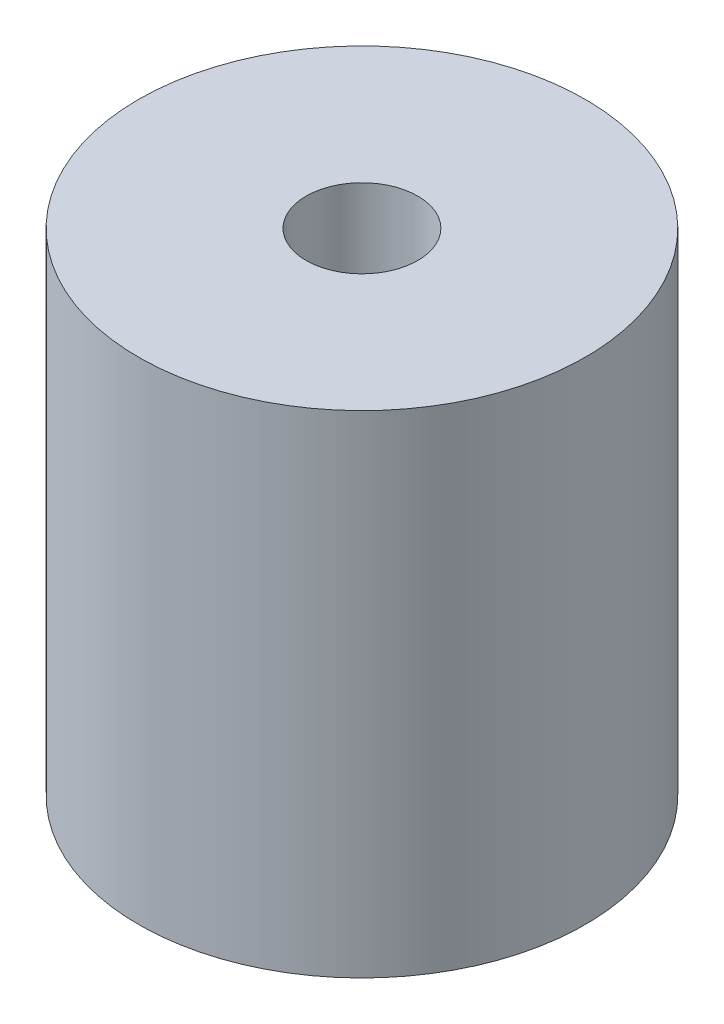
ISO-10303-21;
HEADER;
FILE_DESCRIPTION(('STEP AP214'),'2;1');
FILE_NAME('part.step','',(''),(''),'','','');
FILE_SCHEMA(('AUTOMOTIVE_DESIGN { 1 0 10303 214 1 1 1 1 }'));
ENDSEC;
DATA;
#1=APPLICATION_CONTEXT('core data for automotive mechanical design processes');
#2=APPLICATION_PROTOCOL_DEFINITION('international standard','automotive_design',2000,#1);
#3=PRODUCT_CONTEXT('',#1,'mechanical');
#4=PRODUCT('Part','Part','',(#3));
#5=PRODUCT_RELATED_PRODUCT_CATEGORY('part','',(#4));
#6=PRODUCT_DEFINITION_FORMATION('','',#4);
#7=PRODUCT_DEFINITION_CONTEXT('part definition',#1,'design');
#8=PRODUCT_DEFINITION('design','',#6,#7);
#9=PRODUCT_DEFINITION_SHAPE('','',#8);
#10=(LENGTH_UNIT() NAMED_UNIT(*) SI_UNIT(.MILLI.,.METRE.));
#11=(NAMED_UNIT(*) PLANE_ANGLE_UNIT() SI_UNIT($,.RADIAN.));
#12=(NAMED_UNIT(*) SI_UNIT($,.STERADIAN.) SOLID_ANGLE_UNIT());
#13=UNCERTAINTY_MEASURE_WITH_UNIT(LENGTH_MEASURE(1.E-05),#10,'distance_accuracy_value','');
#14=(GEOMETRIC_REPRESENTATION_CONTEXT(3) GLOBAL_UNCERTAINTY_ASSIGNED_CONTEXT((#13)) GLOBAL_UNIT_ASSIGNED_CONTEXT((#10,
#11,#12)) REPRESENTATION_CONTEXT('',''));
#15=CARTESIAN_POINT('',(0.,0.,0.));
#16=DIRECTION('',(0.,0.,1.));
#17=DIRECTION('',(1.,0.,0.));
#18=AXIS2_PLACEMENT_3D('',#15,#16,#17);
#19=CARTESIAN_POINT('',(-3.12970886277045,20.6989188574241,0.));
#20=DIRECTION('',(0.,1.,0.));
#21=DIRECTION('',(-1.,0.,0.));
#22=AXIS2_PLACEMENT_3D('',#19,#20,#21);
#23=CYLINDRICAL_SURFACE('',#22,10.);
#24=CARTESIAN_POINT('',(-3.12970886277045,-1.30108114257594,0.));
#25=DIRECTION('',(0.,1.,0.));
#26=DIRECTION('',(-1.,0.,0.));
#27=AXIS2_PLACEMENT_3D('',#24,#25,#26);
#28=CIRCLE('',#27,10.);
#29=CARTESIAN_POINT('',(-13.1297088627705,-1.30108114257594,0.));
#30=VERTEX_POINT('',#29);
#31=EDGE_CURVE('E64',#30,#30,#28,.T.);
#32=ORIENTED_EDGE('',*,*,#31,.T.);
#33=EDGE_LOOP('',(#32));
#34=FACE_BOUND('',#33,.T.);
#35=CARTESIAN_POINT('',(-3.12970886277045,20.6989188574241,0.));
#36=DIRECTION('',(0.,1.,0.));
#37=DIRECTION('',(-1.,0.,0.));
#38=AXIS2_PLACEMENT_3D('',#35,#36,#37);
#39=CIRCLE('',#38,10.);
#40=CARTESIAN_POINT('',(-13.1297088627705,20.6989188574241,0.));
#41=VERTEX_POINT('',#40);
#42=EDGE_CURVE('E10',#41,#41,#39,.T.);
#43=ORIENTED_EDGE('',*,*,#42,.F.);
#44=EDGE_LOOP('',(#43));
#45=FACE_BOUND('',#44,.T.);
#46=ADVANCED_FACE('F37',(#34,#45),#23,.T.);
#47=CARTESIAN_POINT('',(-13.1297088627705,20.6989188574241,0.));
#48=DIRECTION('',(0.,1.,0.));
#49=DIRECTION('',(-1.,0.,0.));
#50=AXIS2_PLACEMENT_3D('',#47,#48,#49);
#51=PLANE('',#50);
#52=ORIENTED_EDGE('',*,*,#42,.T.);
#53=EDGE_LOOP('',(#52));
#54=FACE_BOUND('',#53,.T.);
#55=CARTESIAN_POINT('',(-3.12970886277045,20.6989188574241,0.));
#56=DIRECTION('',(0.,1.,0.));
#57=DIRECTION('',(-1.,0.,0.));
#58=AXIS2_PLACEMENT_3D('',#55,#56,#57);
#59=CIRCLE('',#58,2.5);
#60=CARTESIAN_POINT('',(-5.62970886277045,20.6989188574241,0.));
#61=VERTEX_POINT('',#60);
#62=EDGE_CURVE('E44',#61,#61,#59,.T.);
#63=ORIENTED_EDGE('',*,*,#62,.F.);
#64=EDGE_LOOP('',(#63));
#65=FACE_BOUND('',#64,.T.);
#66=ADVANCED_FACE('F83',(#54,#65),#51,.T.);
#67=CARTESIAN_POINT('',(-3.12970886277045,20.6989188574241,0.));
#68=DIRECTION('',(0.,1.,0.));
#69=DIRECTION('',(-1.,0.,0.));
#70=AXIS2_PLACEMENT_3D('',#67,#68,#69);
#71=CYLINDRICAL_SURFACE('',#70,2.5);
#72=ORIENTED_EDGE('',*,*,#62,.T.);
#73=EDGE_LOOP('',(#72));
#74=FACE_BOUND('',#73,.T.);
#75=CARTESIAN_POINT('',(-3.12970886277045,14.6989188574241,0.));
#76=DIRECTION('',(0.,1.,0.));
#77=DIRECTION('',(-1.,0.,0.));
#78=AXIS2_PLACEMENT_3D('',#75,#76,#77);
#79=CIRCLE('',#78,2.5);
#80=CARTESIAN_POINT('',(-5.62970886277045,14.6989188574241,0.));
#81=VERTEX_POINT('',#80);
#82=EDGE_CURVE('E49',#81,#81,#79,.T.);
#83=ORIENTED_EDGE('',*,*,#82,.F.);
#84=EDGE_LOOP('',(#83));
#85=FACE_BOUND('',#84,.T.);
#86=ADVANCED_FACE('F87',(#74,#85),#71,.F.);
#87=CARTESIAN_POINT('',(-5.62970886277045,14.6989188574241,0.));
#88=DIRECTION('',(0.,-1.,0.));
#89=DIRECTION('',(1.,0.,0.));
#90=AXIS2_PLACEMENT_3D('',#87,#88,#89);
#91=PLANE('',#90);
#92=ORIENTED_EDGE('',*,*,#82,.T.);
#93=EDGE_LOOP('',(#92));
#94=FACE_BOUND('',#93,.T.);
#95=CARTESIAN_POINT('',(-3.12970886277045,14.6989188574241,0.));
#96=DIRECTION('',(0.,1.,0.));
#97=DIRECTION('',(-1.,0.,0.));
#98=AXIS2_PLACEMENT_3D('',#95,#96,#97);
#99=CIRCLE('',#98,6.);
#100=CARTESIAN_POINT('',(-9.12970886277045,14.6989188574241,0.));
#101=VERTEX_POINT('',#100);
#102=EDGE_CURVE('E54',#101,#101,#99,.T.);
#103=ORIENTED_EDGE('',*,*,#102,.F.);
#104=EDGE_LOOP('',(#103));
#105=FACE_BOUND('',#104,.T.);
#106=ADVANCED_FACE('F79',(#94,#105),#91,.T.);
#107=CARTESIAN_POINT('',(-3.12970886277045,20.6989188574241,0.));
#108=DIRECTION('',(0.,1.,0.));
#109=DIRECTION('',(-1.,0.,0.));
#110=AXIS2_PLACEMENT_3D('',#107,#108,#109);
#111=CYLINDRICAL_SURFACE('',#110,6.);
#112=ORIENTED_EDGE('',*,*,#102,.T.);
#113=EDGE_LOOP('',(#112));
#114=FACE_BOUND('',#113,.T.);
#115=CARTESIAN_POINT('',(-3.12970886277045,-1.30108114257594,0.));
#116=DIRECTION('',(0.,1.,0.));
#117=DIRECTION('',(-1.,0.,0.));
#118=AXIS2_PLACEMENT_3D('',#115,#116,#117);
#119=CIRCLE('',#118,6.);
#120=CARTESIAN_POINT('',(-9.12970886277045,-1.30108114257594,0.));
#121=VERTEX_POINT('',#120);
#122=EDGE_CURVE('E60',#121,#121,#119,.T.);
#123=ORIENTED_EDGE('',*,*,#122,.F.);
#124=EDGE_LOOP('',(#123));
#125=FACE_BOUND('',#124,.T.);
#126=ADVANCED_FACE('F73',(#114,#125),#111,.F.);
#127=CARTESIAN_POINT('',(-9.12970886277045,-1.30108114257594,0.));
#128=DIRECTION('',(0.,-1.,0.));
#129=DIRECTION('',(1.,0.,0.));
#130=AXIS2_PLACEMENT_3D('',#127,#128,#129);
#131=PLANE('',#130);
#132=ORIENTED_EDGE('',*,*,#122,.T.);
#133=EDGE_LOOP('',(#132));
#134=FACE_BOUND('',#133,.T.);
#135=ORIENTED_EDGE('',*,*,#31,.F.);
#136=EDGE_LOOP('',(#135));
#137=FACE_BOUND('',#136,.T.);
#138=ADVANCED_FACE('F71',(#134,#137),#131,.T.);
#139=CLOSED_SHELL('',(#46,#66,#86,#106,#126,#138));
#140=MANIFOLD_SOLID_BREP('B2',#139);
#141=ADVANCED_BREP_SHAPE_REPRESENTATION('',(#18,#140),#14);
#142=SHAPE_DEFINITION_REPRESENTATION(#9,#141);
ENDSEC;
END-ISO-10303-21;
